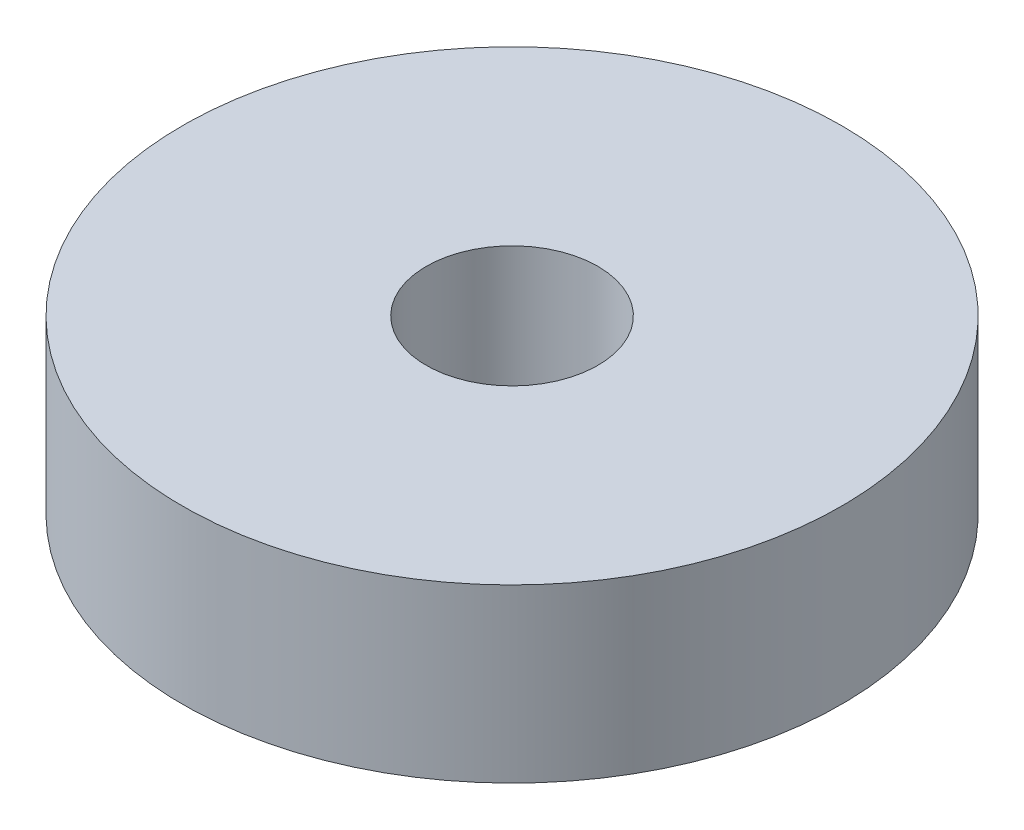
ISO-10303-21;
HEADER;
FILE_DESCRIPTION(('STEP AP214'),'2;1');
FILE_NAME('part.step','',(''),(''),'','','');
FILE_SCHEMA(('AUTOMOTIVE_DESIGN { 1 0 10303 214 1 1 1 1 }'));
ENDSEC;
DATA;
#1=APPLICATION_CONTEXT('core data for automotive mechanical design processes');
#2=APPLICATION_PROTOCOL_DEFINITION('international standard','automotive_design',2000,#1);
#3=PRODUCT_CONTEXT('',#1,'mechanical');
#4=PRODUCT('Part','Part','',(#3));
#5=PRODUCT_RELATED_PRODUCT_CATEGORY('part','',(#4));
#6=PRODUCT_DEFINITION_FORMATION('','',#4);
#7=PRODUCT_DEFINITION_CONTEXT('part definition',#1,'design');
#8=PRODUCT_DEFINITION('design','',#6,#7);
#9=PRODUCT_DEFINITION_SHAPE('','',#8);
#10=(LENGTH_UNIT() NAMED_UNIT(*) SI_UNIT(.MILLI.,.METRE.));
#11=(NAMED_UNIT(*) PLANE_ANGLE_UNIT() SI_UNIT($,.RADIAN.));
#12=(NAMED_UNIT(*) SI_UNIT($,.STERADIAN.) SOLID_ANGLE_UNIT());
#13=UNCERTAINTY_MEASURE_WITH_UNIT(LENGTH_MEASURE(1.E-05),#10,'distance_accuracy_value','');
#14=(GEOMETRIC_REPRESENTATION_CONTEXT(3) GLOBAL_UNCERTAINTY_ASSIGNED_CONTEXT((#13)) GLOBAL_UNIT_ASSIGNED_CONTEXT((#10,
#11,#12)) REPRESENTATION_CONTEXT('',''));
#15=CARTESIAN_POINT('',(0.,0.,0.));
#16=DIRECTION('',(0.,0.,1.));
#17=DIRECTION('',(1.,0.,0.));
#18=AXIS2_PLACEMENT_3D('',#15,#16,#17);
#19=CARTESIAN_POINT('',(0.,0.,0.));
#20=DIRECTION('',(0.,-1.,0.));
#21=DIRECTION('',(0.,0.,-1.));
#22=AXIS2_PLACEMENT_3D('',#19,#20,#21);
#23=CYLINDRICAL_SURFACE('',#22,1.5875);
#24=CARTESIAN_POINT('',(0.,-1.5875,0.));
#25=DIRECTION('',(0.,-1.,0.));
#26=DIRECTION('',(0.,0.,-1.));
#27=AXIS2_PLACEMENT_3D('',#24,#25,#26);
#28=CIRCLE('',#27,1.5875);
#29=CARTESIAN_POINT('',(0.,-1.5875,-1.5875));
#30=VERTEX_POINT('',#29);
#31=EDGE_CURVE('E45',#30,#30,#28,.T.);
#32=ORIENTED_EDGE('',*,*,#31,.T.);
#33=EDGE_LOOP('',(#32));
#34=FACE_BOUND('',#33,.T.);
#35=CARTESIAN_POINT('',(0.,1.5875,0.));
#36=DIRECTION('',(0.,-1.,0.));
#37=DIRECTION('',(0.,0.,-1.));
#38=AXIS2_PLACEMENT_3D('',#35,#36,#37);
#39=CIRCLE('',#38,1.5875);
#40=CARTESIAN_POINT('',(0.,1.5875,-1.5875));
#41=VERTEX_POINT('',#40);
#42=EDGE_CURVE('E10',#41,#41,#39,.T.);
#43=ORIENTED_EDGE('',*,*,#42,.F.);
#44=EDGE_LOOP('',(#43));
#45=FACE_BOUND('',#44,.T.);
#46=ADVANCED_FACE('F31',(#34,#45),#23,.F.);
#47=CARTESIAN_POINT('',(6.096,1.5875,0.));
#48=DIRECTION('',(0.,1.,0.));
#49=DIRECTION('',(0.,0.,1.));
#50=AXIS2_PLACEMENT_3D('',#47,#48,#49);
#51=PLANE('',#50);
#52=ORIENTED_EDGE('',*,*,#42,.T.);
#53=EDGE_LOOP('',(#52));
#54=FACE_BOUND('',#53,.T.);
#55=CARTESIAN_POINT('',(0.,1.5875,0.));
#56=DIRECTION('',(0.,-1.,0.));
#57=DIRECTION('',(0.,0.,-1.));
#58=AXIS2_PLACEMENT_3D('',#55,#56,#57);
#59=CIRCLE('',#58,6.096);
#60=CARTESIAN_POINT('',(0.,1.5875,-6.096));
#61=VERTEX_POINT('',#60);
#62=EDGE_CURVE('E37',#61,#61,#59,.T.);
#63=ORIENTED_EDGE('',*,*,#62,.F.);
#64=EDGE_LOOP('',(#63));
#65=FACE_BOUND('',#64,.T.);
#66=ADVANCED_FACE('F61',(#54,#65),#51,.T.);
#67=CARTESIAN_POINT('',(0.,0.,0.));
#68=DIRECTION('',(0.,-1.,0.));
#69=DIRECTION('',(0.,0.,-1.));
#70=AXIS2_PLACEMENT_3D('',#67,#68,#69);
#71=CYLINDRICAL_SURFACE('',#70,6.096);
#72=ORIENTED_EDGE('',*,*,#62,.T.);
#73=EDGE_LOOP('',(#72));
#74=FACE_BOUND('',#73,.T.);
#75=CARTESIAN_POINT('',(0.,-1.5875,0.));
#76=DIRECTION('',(0.,-1.,0.));
#77=DIRECTION('',(0.,0.,-1.));
#78=AXIS2_PLACEMENT_3D('',#75,#76,#77);
#79=CIRCLE('',#78,6.096);
#80=CARTESIAN_POINT('',(0.,-1.5875,-6.096));
#81=VERTEX_POINT('',#80);
#82=EDGE_CURVE('E41',#81,#81,#79,.T.);
#83=ORIENTED_EDGE('',*,*,#82,.F.);
#84=EDGE_LOOP('',(#83));
#85=FACE_BOUND('',#84,.T.);
#86=ADVANCED_FACE('F55',(#74,#85),#71,.T.);
#87=CARTESIAN_POINT('',(6.096,-1.5875,0.));
#88=DIRECTION('',(0.,-1.,0.));
#89=DIRECTION('',(0.,0.,-1.));
#90=AXIS2_PLACEMENT_3D('',#87,#88,#89);
#91=PLANE('',#90);
#92=ORIENTED_EDGE('',*,*,#82,.T.);
#93=EDGE_LOOP('',(#92));
#94=FACE_BOUND('',#93,.T.);
#95=ORIENTED_EDGE('',*,*,#31,.F.);
#96=EDGE_LOOP('',(#95));
#97=FACE_BOUND('',#96,.T.);
#98=ADVANCED_FACE('F53',(#94,#97),#91,.T.);
#99=CLOSED_SHELL('',(#46,#66,#86,#98));
#100=MANIFOLD_SOLID_BREP('B2',#99);
#101=ADVANCED_BREP_SHAPE_REPRESENTATION('',(#18,#100),#14);
#102=SHAPE_DEFINITION_REPRESENTATION(#9,#101);
ENDSEC;
END-ISO-10303-21;
